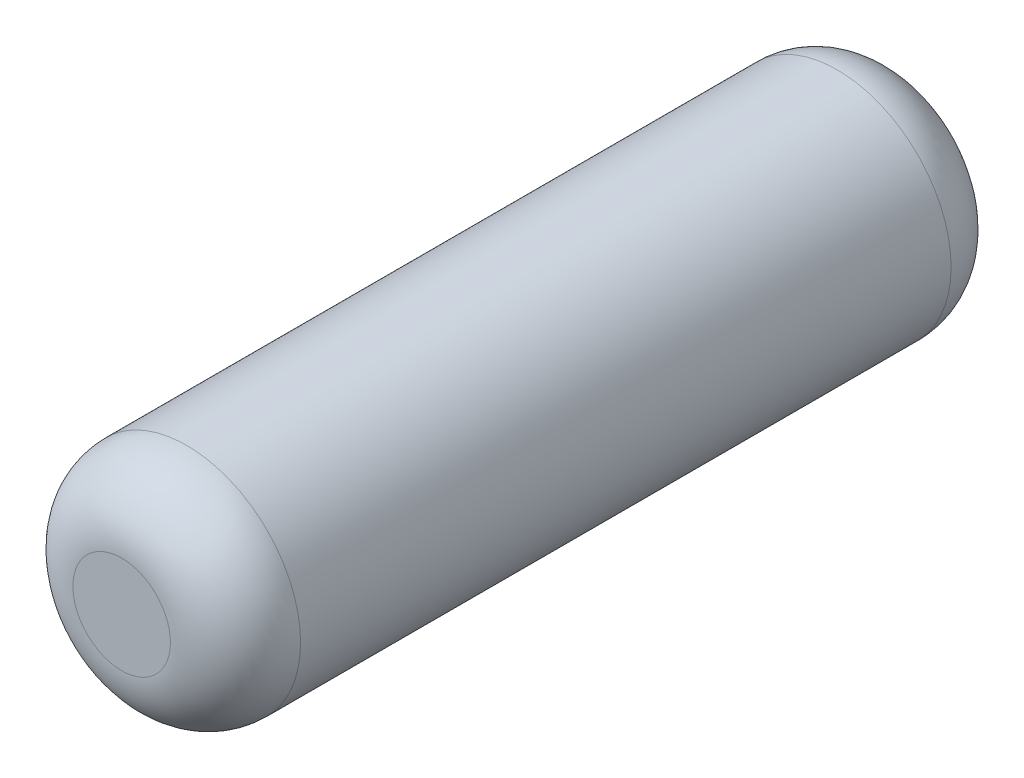
ISO-10303-21;
HEADER;
FILE_DESCRIPTION(('STEP AP214'),'2;1');
FILE_NAME('part.step','',(''),(''),'','','');
FILE_SCHEMA(('AUTOMOTIVE_DESIGN { 1 0 10303 214 1 1 1 1 }'));
ENDSEC;
DATA;
#1=APPLICATION_CONTEXT('core data for automotive mechanical design processes');
#2=APPLICATION_PROTOCOL_DEFINITION('international standard','automotive_design',2000,#1);
#3=PRODUCT_CONTEXT('',#1,'mechanical');
#4=PRODUCT('Part','Part','',(#3));
#5=PRODUCT_RELATED_PRODUCT_CATEGORY('part','',(#4));
#6=PRODUCT_DEFINITION_FORMATION('','',#4);
#7=PRODUCT_DEFINITION_CONTEXT('part definition',#1,'design');
#8=PRODUCT_DEFINITION('design','',#6,#7);
#9=PRODUCT_DEFINITION_SHAPE('','',#8);
#10=(LENGTH_UNIT() NAMED_UNIT(*) SI_UNIT(.MILLI.,.METRE.));
#11=(NAMED_UNIT(*) PLANE_ANGLE_UNIT() SI_UNIT($,.RADIAN.));
#12=(NAMED_UNIT(*) SI_UNIT($,.STERADIAN.) SOLID_ANGLE_UNIT());
#13=UNCERTAINTY_MEASURE_WITH_UNIT(LENGTH_MEASURE(1.E-05),#10,'distance_accuracy_value','');
#14=(GEOMETRIC_REPRESENTATION_CONTEXT(3) GLOBAL_UNCERTAINTY_ASSIGNED_CONTEXT((#13)) GLOBAL_UNIT_ASSIGNED_CONTEXT((#10,
#11,#12)) REPRESENTATION_CONTEXT('',''));
#15=CARTESIAN_POINT('',(0.,0.,0.));
#16=DIRECTION('',(0.,0.,1.));
#17=DIRECTION('',(1.,0.,0.));
#18=AXIS2_PLACEMENT_3D('',#15,#16,#17);
#19=CARTESIAN_POINT('',(0.,0.,304.8));
#20=DIRECTION('',(0.,0.,-1.));
#21=DIRECTION('',(-1.,0.,0.));
#22=AXIS2_PLACEMENT_3D('',#19,#20,#21);
#23=CYLINDRICAL_SURFACE('',#22,44.45);
#24=CARTESIAN_POINT('',(0.,0.,279.4));
#25=DIRECTION('',(0.,0.,1.));
#26=DIRECTION('',(1.,0.,0.));
#27=AXIS2_PLACEMENT_3D('',#24,#25,#26);
#28=CIRCLE('',#27,44.45);
#29=CARTESIAN_POINT('',(-44.45,0.,279.4));
#30=VERTEX_POINT('',#29);
#31=EDGE_CURVE('E37',#30,#30,#28,.F.);
#32=CARTESIAN_POINT('',(0.,0.,25.3999999999998));
#33=DIRECTION('',(0.,0.,1.));
#34=DIRECTION('',(1.,0.,0.));
#35=AXIS2_PLACEMENT_3D('',#32,#33,#34);
#36=CIRCLE('',#35,44.45);
#37=CARTESIAN_POINT('',(-44.45,0.,25.3999999999998));
#38=VERTEX_POINT('',#37);
#39=EDGE_CURVE('E41',#38,#38,#36,.T.);
#40=CARTESIAN_POINT('',(-44.45,0.,279.4));
#41=CARTESIAN_POINT('',(-44.45,0.,276.754166666667));
#42=CARTESIAN_POINT('',(-44.45,0.,274.108333333333));
#43=CARTESIAN_POINT('',(-44.45,0.,268.816666666667));
#44=CARTESIAN_POINT('',(-44.45,0.,266.170833333333));
#45=CARTESIAN_POINT('',(-44.45,0.,260.879166666667));
#46=CARTESIAN_POINT('',(-44.45,0.,258.233333333333));
#47=CARTESIAN_POINT('',(-44.45,0.,252.941666666667));
#48=CARTESIAN_POINT('',(-44.45,0.,250.295833333333));
#49=CARTESIAN_POINT('',(-44.45,0.,245.004166666667));
#50=CARTESIAN_POINT('',(-44.45,0.,242.358333333333));
#51=CARTESIAN_POINT('',(-44.45,0.,237.066666666667));
#52=CARTESIAN_POINT('',(-44.45,0.,234.420833333333));
#53=CARTESIAN_POINT('',(-44.45,0.,229.129166666667));
#54=CARTESIAN_POINT('',(-44.45,0.,226.483333333333));
#55=CARTESIAN_POINT('',(-44.45,0.,221.191666666667));
#56=CARTESIAN_POINT('',(-44.45,0.,218.545833333333));
#57=CARTESIAN_POINT('',(-44.45,0.,213.254166666667));
#58=CARTESIAN_POINT('',(-44.45,0.,210.608333333333));
#59=CARTESIAN_POINT('',(-44.45,0.,205.316666666667));
#60=CARTESIAN_POINT('',(-44.45,0.,202.670833333333));
#61=CARTESIAN_POINT('',(-44.45,0.,197.379166666667));
#62=CARTESIAN_POINT('',(-44.45,0.,194.733333333333));
#63=CARTESIAN_POINT('',(-44.45,0.,189.441666666667));
#64=CARTESIAN_POINT('',(-44.45,0.,186.795833333333));
#65=CARTESIAN_POINT('',(-44.45,0.,181.504166666667));
#66=CARTESIAN_POINT('',(-44.45,0.,178.858333333333));
#67=CARTESIAN_POINT('',(-44.45,0.,173.566666666667));
#68=CARTESIAN_POINT('',(-44.45,0.,170.920833333333));
#69=CARTESIAN_POINT('',(-44.45,0.,165.629166666667));
#70=CARTESIAN_POINT('',(-44.45,0.,162.983333333333));
#71=CARTESIAN_POINT('',(-44.45,0.,157.691666666667));
#72=CARTESIAN_POINT('',(-44.45,0.,155.045833333333));
#73=CARTESIAN_POINT('',(-44.45,0.,149.754166666667));
#74=CARTESIAN_POINT('',(-44.45,0.,147.108333333333));
#75=CARTESIAN_POINT('',(-44.45,0.,141.816666666667));
#76=CARTESIAN_POINT('',(-44.45,0.,139.170833333333));
#77=CARTESIAN_POINT('',(-44.45,0.,133.879166666666));
#78=CARTESIAN_POINT('',(-44.45,0.,131.233333333333));
#79=CARTESIAN_POINT('',(-44.45,0.,125.941666666666));
#80=CARTESIAN_POINT('',(-44.45,0.,123.295833333333));
#81=CARTESIAN_POINT('',(-44.45,0.,118.004166666666));
#82=CARTESIAN_POINT('',(-44.45,0.,115.358333333333));
#83=CARTESIAN_POINT('',(-44.45,0.,110.066666666666));
#84=CARTESIAN_POINT('',(-44.45,0.,107.420833333333));
#85=CARTESIAN_POINT('',(-44.45,0.,102.129166666666));
#86=CARTESIAN_POINT('',(-44.45,0.,99.4833333333331));
#87=CARTESIAN_POINT('',(-44.45,0.,94.1916666666665));
#88=CARTESIAN_POINT('',(-44.45,0.,91.5458333333331));
#89=CARTESIAN_POINT('',(-44.45,0.,86.2541666666664));
#90=CARTESIAN_POINT('',(-44.45,0.,83.6083333333331));
#91=CARTESIAN_POINT('',(-44.45,0.,78.3166666666664));
#92=CARTESIAN_POINT('',(-44.45,0.,75.6708333333331));
#93=CARTESIAN_POINT('',(-44.45,0.,70.3791666666664));
#94=CARTESIAN_POINT('',(-44.45,0.,67.7333333333331));
#95=CARTESIAN_POINT('',(-44.45,0.,62.4416666666664));
#96=CARTESIAN_POINT('',(-44.45,0.,59.7958333333331));
#97=CARTESIAN_POINT('',(-44.45,0.,54.5041666666664));
#98=CARTESIAN_POINT('',(-44.45,0.,51.8583333333331));
#99=CARTESIAN_POINT('',(-44.45,0.,46.5666666666664));
#100=CARTESIAN_POINT('',(-44.45,0.,43.9208333333331));
#101=CARTESIAN_POINT('',(-44.45,0.,38.6291666666664));
#102=CARTESIAN_POINT('',(-44.45,0.,35.9833333333331));
#103=CARTESIAN_POINT('',(-44.45,0.,30.6916666666664));
#104=CARTESIAN_POINT('',(-44.45,0.,28.0458333333331));
#105=CARTESIAN_POINT('',(-44.45,0.,25.3999999999998));
#106=B_SPLINE_CURVE_WITH_KNOTS('',3,(#40,#41,#42,#43,#44,#45,#46,#47,#48,#49,#50,#51,#52,#53,
#54,#55,#56,#57,#58,#59,#60,#61,#62,#63,#64,#65,#66,#67,#68,#69,#70,#71,#72,#73,#74,#75,#76,#77,
#78,#79,#80,#81,#82,#83,#84,#85,#86,#87,#88,#89,#90,#91,#92,#93,#94,#95,#96,#97,#98,#99,#100,
#101,#102,#103,#104,#105),.UNSPECIFIED.,.F.,.F.,(4,2,2,2,2,2,2,2,2,2,2,2,2,2,2,2,2,2,2,2,2,2,2,
2,2,2,2,2,2,2,2,2,4),(0.,7.93750000000004,15.875,23.8125000000001,31.7500000000001,
39.6875000000001,47.6250000000001,55.5625000000001,63.5000000000001,71.4375000000001,
79.3750000000001,87.3125000000001,95.2500000000001,103.1875,111.125,119.0625,127.,134.9375,
142.875,150.8125,158.75,166.6875,174.625,182.5625,190.5,198.4375,206.375,214.3125,222.25,
230.1875,238.125,246.0625,254.),.UNSPECIFIED.);
#107=EDGE_CURVE('BSEAM30',#30,#38,#106,.T.);
#108=ORIENTED_EDGE('',*,*,#31,.T.);
#109=ORIENTED_EDGE('',*,*,#39,.T.);
#110=ORIENTED_EDGE('',*,*,#107,.T.);
#111=ORIENTED_EDGE('',*,*,#107,.F.);
#112=EDGE_LOOP('',(#108,#110,#109,#111));
#113=FACE_BOUND('',#112,.T.);
#114=ADVANCED_FACE('F30',(#113),#23,.T.);
#115=CARTESIAN_POINT('',(0.,0.,304.8));
#116=DIRECTION('',(0.,0.,1.));
#117=DIRECTION('',(1.,0.,0.));
#118=AXIS2_PLACEMENT_3D('',#115,#116,#117);
#119=PLANE('',#118);
#120=CARTESIAN_POINT('',(0.,0.,304.8));
#121=DIRECTION('',(0.,0.,1.));
#122=DIRECTION('',(1.,0.,0.));
#123=AXIS2_PLACEMENT_3D('',#120,#121,#122);
#124=CIRCLE('',#123,19.05);
#125=CARTESIAN_POINT('',(19.05,0.,304.8));
#126=VERTEX_POINT('',#125);
#127=EDGE_CURVE('E45',#126,#126,#124,.T.);
#128=ORIENTED_EDGE('',*,*,#127,.T.);
#129=EDGE_LOOP('',(#128));
#130=FACE_BOUND('',#129,.T.);
#131=ADVANCED_FACE('F51',(#130),#119,.T.);
#132=CARTESIAN_POINT('',(0.,0.,0.));
#133=DIRECTION('',(0.,0.,1.));
#134=DIRECTION('',(1.,0.,0.));
#135=AXIS2_PLACEMENT_3D('',#132,#133,#134);
#136=PLANE('',#135);
#137=CARTESIAN_POINT('',(0.,0.,0.));
#138=DIRECTION('',(0.,0.,1.));
#139=DIRECTION('',(1.,0.,0.));
#140=AXIS2_PLACEMENT_3D('',#137,#138,#139);
#141=CIRCLE('',#140,19.05);
#142=CARTESIAN_POINT('',(19.05,0.,0.));
#143=VERTEX_POINT('',#142);
#144=EDGE_CURVE('E10',#143,#143,#141,.F.);
#145=ORIENTED_EDGE('',*,*,#144,.T.);
#146=EDGE_LOOP('',(#145));
#147=FACE_BOUND('',#146,.T.);
#148=ADVANCED_FACE('F55',(#147),#136,.F.);
#149=CARTESIAN_POINT('',(0.,0.,279.4));
#150=DIRECTION('',(0.,0.,1.));
#151=DIRECTION('',(1.,0.,0.));
#152=AXIS2_PLACEMENT_3D('',#149,#150,#151);
#153=DEGENERATE_TOROIDAL_SURFACE('',#152,19.05,25.4,.T.);
#154=ORIENTED_EDGE('',*,*,#31,.F.);
#155=EDGE_LOOP('',(#154));
#156=FACE_BOUND('',#155,.T.);
#157=ORIENTED_EDGE('',*,*,#127,.F.);
#158=EDGE_LOOP('',(#157));
#159=FACE_BOUND('',#158,.T.);
#160=ADVANCED_FACE('F53',(#156,#159),#153,.T.);
#161=CARTESIAN_POINT('',(0.,0.,25.4));
#162=DIRECTION('',(0.,0.,1.));
#163=DIRECTION('',(1.,0.,0.));
#164=AXIS2_PLACEMENT_3D('',#161,#162,#163);
#165=DEGENERATE_TOROIDAL_SURFACE('',#164,19.05,25.4,.T.);
#166=ORIENTED_EDGE('',*,*,#144,.F.);
#167=EDGE_LOOP('',(#166));
#168=FACE_BOUND('',#167,.T.);
#169=ORIENTED_EDGE('',*,*,#39,.F.);
#170=EDGE_LOOP('',(#169));
#171=FACE_BOUND('',#170,.T.);
#172=ADVANCED_FACE('F32',(#168,#171),#165,.T.);
#173=CLOSED_SHELL('',(#114,#131,#148,#160,#172));
#174=MANIFOLD_SOLID_BREP('B2',#173);
#175=ADVANCED_BREP_SHAPE_REPRESENTATION('',(#18,#174),#14);
#176=SHAPE_DEFINITION_REPRESENTATION(#9,#175);
ENDSEC;
END-ISO-10303-21;
